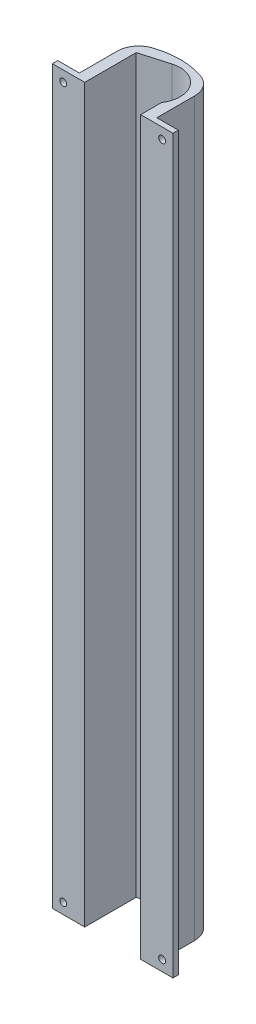
ISO-10303-21;
HEADER;
FILE_DESCRIPTION(('STEP AP214'),'2;1');
FILE_NAME('part.step','',(''),(''),'','','');
FILE_SCHEMA(('AUTOMOTIVE_DESIGN { 1 0 10303 214 1 1 1 1 }'));
ENDSEC;
DATA;
#1=APPLICATION_CONTEXT('core data for automotive mechanical design processes');
#2=APPLICATION_PROTOCOL_DEFINITION('international standard','automotive_design',2000,#1);
#3=PRODUCT_CONTEXT('',#1,'mechanical');
#4=PRODUCT('Part','Part','',(#3));
#5=PRODUCT_RELATED_PRODUCT_CATEGORY('part','',(#4));
#6=PRODUCT_DEFINITION_FORMATION('','',#4);
#7=PRODUCT_DEFINITION_CONTEXT('part definition',#1,'design');
#8=PRODUCT_DEFINITION('design','',#6,#7);
#9=PRODUCT_DEFINITION_SHAPE('','',#8);
#10=(LENGTH_UNIT() NAMED_UNIT(*) SI_UNIT(.MILLI.,.METRE.));
#11=(NAMED_UNIT(*) PLANE_ANGLE_UNIT() SI_UNIT($,.RADIAN.));
#12=(NAMED_UNIT(*) SI_UNIT($,.STERADIAN.) SOLID_ANGLE_UNIT());
#13=UNCERTAINTY_MEASURE_WITH_UNIT(LENGTH_MEASURE(1.E-05),#10,'distance_accuracy_value','');
#14=(GEOMETRIC_REPRESENTATION_CONTEXT(3) GLOBAL_UNCERTAINTY_ASSIGNED_CONTEXT((#13)) GLOBAL_UNIT_ASSIGNED_CONTEXT((#10,
#11,#12)) REPRESENTATION_CONTEXT('',''));
#15=CARTESIAN_POINT('',(0.,0.,0.));
#16=DIRECTION('',(0.,0.,1.));
#17=DIRECTION('',(1.,0.,0.));
#18=AXIS2_PLACEMENT_3D('',#15,#16,#17);
#19=CARTESIAN_POINT('',(-3.8327392524364,269.875,75.5327034117787));
#20=DIRECTION('',(0.,-1.,0.));
#21=DIRECTION('',(0.,0.,-1.));
#22=AXIS2_PLACEMENT_3D('',#19,#20,#21);
#23=CYLINDRICAL_SURFACE('',#22,3.74657028450393);
#24=CARTESIAN_POINT('',(-3.8327392524364,161.925,75.5327034117787));
#25=DIRECTION('',(0.,-1.,0.));
#26=DIRECTION('',(0.,0.,-1.));
#27=AXIS2_PLACEMENT_3D('',#24,#25,#26);
#28=CIRCLE('',#27,3.74657028450393);
#29=CARTESIAN_POINT('',(-4.87324414830084,161.925,71.9335176068486));
#30=VERTEX_POINT('',#29);
#31=CARTESIAN_POINT('',(-0.721239252436399,161.925,77.6196525359137));
#32=VERTEX_POINT('',#31);
#33=EDGE_CURVE('E169',#30,#32,#28,.T.);
#34=ORIENTED_EDGE('',*,*,#33,.T.);
#35=DIRECTION('',(0.,-1.,0.));
#36=VECTOR('',#35,1.);
#37=CARTESIAN_POINT('',(-0.721239252436399,269.875,77.6196525359137));
#38=LINE('',#37,#36);
#39=CARTESIAN_POINT('',(-0.721239252436399,269.875,77.6196525359137));
#40=VERTEX_POINT('',#39);
#41=EDGE_CURVE('E151',#40,#32,#38,.T.);
#42=ORIENTED_EDGE('',*,*,#41,.F.);
#43=CARTESIAN_POINT('',(-3.8327392524364,269.875,75.5327034117787));
#44=DIRECTION('',(0.,-1.,0.));
#45=DIRECTION('',(0.,0.,-1.));
#46=AXIS2_PLACEMENT_3D('',#43,#44,#45);
#47=CIRCLE('',#46,3.74657028450393);
#48=CARTESIAN_POINT('',(-4.87324414830084,269.875,71.9335176068486));
#49=VERTEX_POINT('',#48);
#50=EDGE_CURVE('E157',#49,#40,#47,.T.);
#51=ORIENTED_EDGE('',*,*,#50,.F.);
#52=DIRECTION('',(0.,-1.,0.));
#53=VECTOR('',#52,1.);
#54=CARTESIAN_POINT('',(-4.87324414830084,269.875,71.9335176068486));
#55=LINE('',#54,#53);
#56=EDGE_CURVE('E228',#49,#30,#55,.T.);
#57=ORIENTED_EDGE('',*,*,#56,.T.);
#58=EDGE_LOOP('',(#34,#42,#51,#57));
#59=FACE_BOUND('',#58,.T.);
#60=ADVANCED_FACE('F37',(#59),#23,.F.);
#61=CARTESIAN_POINT('',(-0.7212392524364,269.875,80.7193816335613));
#62=DIRECTION('',(1.,0.,0.));
#63=DIRECTION('',(0.,0.,-1.));
#64=AXIS2_PLACEMENT_3D('',#61,#62,#63);
#65=PLANE('',#64);
#66=DIRECTION('',(0.,0.,1.));
#67=VECTOR('',#66,1.);
#68=CARTESIAN_POINT('',(-0.7212392524364,161.925,80.7193816335613));
#69=LINE('',#68,#67);
#70=CARTESIAN_POINT('',(-0.7212392524364,161.925,80.7193816335613));
#71=VERTEX_POINT('',#70);
#72=EDGE_CURVE('E259',#32,#71,#69,.T.);
#73=ORIENTED_EDGE('',*,*,#72,.T.);
#74=DIRECTION('',(0.,-1.,0.));
#75=VECTOR('',#74,1.);
#76=CARTESIAN_POINT('',(-0.7212392524364,269.875,80.7193816335613));
#77=LINE('',#76,#75);
#78=CARTESIAN_POINT('',(-0.7212392524364,269.875,80.7193816335613));
#79=VERTEX_POINT('',#78);
#80=EDGE_CURVE('E154',#79,#71,#77,.T.);
#81=ORIENTED_EDGE('',*,*,#80,.F.);
#82=DIRECTION('',(0.,0.,1.));
#83=VECTOR('',#82,1.);
#84=CARTESIAN_POINT('',(-0.7212392524364,269.875,80.7193816335613));
#85=LINE('',#84,#83);
#86=EDGE_CURVE('E147',#40,#79,#85,.T.);
#87=ORIENTED_EDGE('',*,*,#86,.F.);
#88=ORIENTED_EDGE('',*,*,#41,.T.);
#89=EDGE_LOOP('',(#73,#81,#87,#88));
#90=FACE_BOUND('',#89,.T.);
#91=ADVANCED_FACE('F149',(#90),#65,.F.);
#92=CARTESIAN_POINT('',(-0.7212392524364,269.875,80.7193816335613));
#93=DIRECTION('',(0.,0.,-1.));
#94=DIRECTION('',(-1.,0.,0.));
#95=AXIS2_PLACEMENT_3D('',#92,#93,#94);
#96=PLANE('',#95);
#97=CARTESIAN_POINT('',(2.4537607475636,163.5125,80.7193816335613));
#98=DIRECTION('',(0.,0.,-1.));
#99=DIRECTION('',(-1.,0.,0.));
#100=AXIS2_PLACEMENT_3D('',#97,#98,#99);
#101=CIRCLE('',#100,0.508000000000002);
#102=CARTESIAN_POINT('',(1.9457607475636,163.5125,80.7193816335613));
#103=VERTEX_POINT('',#102);
#104=EDGE_CURVE('E283',#103,#103,#101,.T.);
#105=ORIENTED_EDGE('',*,*,#104,.T.);
#106=EDGE_LOOP('',(#105));
#107=FACE_BOUND('',#106,.T.);
#108=CARTESIAN_POINT('',(2.4537607475636,268.2875,80.7193816335613));
#109=DIRECTION('',(0.,0.,-1.));
#110=DIRECTION('',(-1.,0.,0.));
#111=AXIS2_PLACEMENT_3D('',#108,#109,#110);
#112=CIRCLE('',#111,0.508000000000006);
#113=CARTESIAN_POINT('',(1.94576074756359,268.2875,80.7193816335613));
#114=VERTEX_POINT('',#113);
#115=EDGE_CURVE('E264',#114,#114,#112,.T.);
#116=ORIENTED_EDGE('',*,*,#115,.T.);
#117=EDGE_LOOP('',(#116));
#118=FACE_BOUND('',#117,.T.);
#119=DIRECTION('',(1.,0.,0.));
#120=VECTOR('',#119,1.);
#121=CARTESIAN_POINT('',(-0.7212392524364,161.925,80.7193816335613));
#122=LINE('',#121,#120);
#123=CARTESIAN_POINT('',(4.0412607475636,161.925,80.7193816335613));
#124=VERTEX_POINT('',#123);
#125=EDGE_CURVE('E258',#71,#124,#122,.T.);
#126=ORIENTED_EDGE('',*,*,#125,.T.);
#127=DIRECTION('',(0.,-1.,0.));
#128=VECTOR('',#127,1.);
#129=CARTESIAN_POINT('',(4.0412607475636,269.875,80.7193816335613));
#130=LINE('',#129,#128);
#131=CARTESIAN_POINT('',(4.0412607475636,269.875,80.7193816335613));
#132=VERTEX_POINT('',#131);
#133=EDGE_CURVE('E174',#132,#124,#130,.T.);
#134=ORIENTED_EDGE('',*,*,#133,.F.);
#135=DIRECTION('',(1.,0.,0.));
#136=VECTOR('',#135,1.);
#137=CARTESIAN_POINT('',(-0.7212392524364,269.875,80.7193816335613));
#138=LINE('',#137,#136);
#139=EDGE_CURVE('E156',#79,#132,#138,.T.);
#140=ORIENTED_EDGE('',*,*,#139,.F.);
#141=ORIENTED_EDGE('',*,*,#80,.T.);
#142=EDGE_LOOP('',(#126,#134,#140,#141));
#143=FACE_BOUND('',#142,.T.);
#144=ADVANCED_FACE('F350',(#107,#118,#143),#96,.F.);
#145=CARTESIAN_POINT('',(4.0412607475636,269.875,80.7193816335613));
#146=DIRECTION('',(-1.,0.,0.));
#147=DIRECTION('',(0.,0.,1.));
#148=AXIS2_PLACEMENT_3D('',#145,#146,#147);
#149=PLANE('',#148);
#150=DIRECTION('',(0.,0.,-1.));
#151=VECTOR('',#150,1.);
#152=CARTESIAN_POINT('',(4.0412607475636,161.925,80.7193816335613));
#153=LINE('',#152,#151);
#154=CARTESIAN_POINT('',(4.0412607475636,161.925,79.9256316335613));
#155=VERTEX_POINT('',#154);
#156=EDGE_CURVE('E213',#124,#155,#153,.T.);
#157=ORIENTED_EDGE('',*,*,#156,.T.);
#158=DIRECTION('',(0.,-1.,0.));
#159=VECTOR('',#158,1.);
#160=CARTESIAN_POINT('',(4.0412607475636,269.875,79.9256316335613));
#161=LINE('',#160,#159);
#162=CARTESIAN_POINT('',(4.0412607475636,269.875,79.9256316335613));
#163=VERTEX_POINT('',#162);
#164=EDGE_CURVE('E246',#163,#155,#161,.T.);
#165=ORIENTED_EDGE('',*,*,#164,.F.);
#166=DIRECTION('',(0.,0.,-1.));
#167=VECTOR('',#166,1.);
#168=CARTESIAN_POINT('',(4.0412607475636,269.875,80.7193816335613));
#169=LINE('',#168,#167);
#170=EDGE_CURVE('E255',#132,#163,#169,.T.);
#171=ORIENTED_EDGE('',*,*,#170,.F.);
#172=ORIENTED_EDGE('',*,*,#133,.T.);
#173=EDGE_LOOP('',(#157,#165,#171,#172));
#174=FACE_BOUND('',#173,.T.);
#175=ADVANCED_FACE('F253',(#174),#149,.F.);
#176=CARTESIAN_POINT('',(4.0412607475636,269.875,79.9256316335613));
#177=DIRECTION('',(0.,0.,1.));
#178=DIRECTION('',(1.,0.,0.));
#179=AXIS2_PLACEMENT_3D('',#176,#177,#178);
#180=PLANE('',#179);
#181=CARTESIAN_POINT('',(2.4537607475636,163.5125,79.9256316335613));
#182=DIRECTION('',(0.,0.,-1.));
#183=DIRECTION('',(-1.,0.,0.));
#184=AXIS2_PLACEMENT_3D('',#181,#182,#183);
#185=CIRCLE('',#184,0.508000000000002);
#186=CARTESIAN_POINT('',(1.9457607475636,163.5125,79.9256316335613));
#187=VERTEX_POINT('',#186);
#188=EDGE_CURVE('E293',#187,#187,#185,.T.);
#189=ORIENTED_EDGE('',*,*,#188,.F.);
#190=EDGE_LOOP('',(#189));
#191=FACE_BOUND('',#190,.T.);
#192=CARTESIAN_POINT('',(2.4537607475636,268.2875,79.9256316335613));
#193=DIRECTION('',(0.,0.,-1.));
#194=DIRECTION('',(-1.,0.,0.));
#195=AXIS2_PLACEMENT_3D('',#192,#193,#194);
#196=CIRCLE('',#195,0.508000000000006);
#197=CARTESIAN_POINT('',(1.94576074756359,268.2875,79.9256316335613));
#198=VERTEX_POINT('',#197);
#199=EDGE_CURVE('E280',#198,#198,#196,.T.);
#200=ORIENTED_EDGE('',*,*,#199,.F.);
#201=EDGE_LOOP('',(#200));
#202=FACE_BOUND('',#201,.T.);
#203=DIRECTION('',(-1.,0.,0.));
#204=VECTOR('',#203,1.);
#205=CARTESIAN_POINT('',(4.0412607475636,161.925,79.9256316335613));
#206=LINE('',#205,#204);
#207=CARTESIAN_POINT('',(0.8662607475636,161.925,79.9256316335613));
#208=VERTEX_POINT('',#207);
#209=EDGE_CURVE('E209',#155,#208,#206,.T.);
#210=ORIENTED_EDGE('',*,*,#209,.T.);
#211=DIRECTION('',(0.,-1.,0.));
#212=VECTOR('',#211,1.);
#213=CARTESIAN_POINT('',(0.8662607475636,269.875,79.9256316335613));
#214=LINE('',#213,#212);
#215=CARTESIAN_POINT('',(0.8662607475636,269.875,79.9256316335613));
#216=VERTEX_POINT('',#215);
#217=EDGE_CURVE('E208',#216,#208,#214,.T.);
#218=ORIENTED_EDGE('',*,*,#217,.F.);
#219=DIRECTION('',(-1.,0.,0.));
#220=VECTOR('',#219,1.);
#221=CARTESIAN_POINT('',(4.0412607475636,269.875,79.9256316335613));
#222=LINE('',#221,#220);
#223=EDGE_CURVE('E276',#163,#216,#222,.T.);
#224=ORIENTED_EDGE('',*,*,#223,.F.);
#225=ORIENTED_EDGE('',*,*,#164,.T.);
#226=EDGE_LOOP('',(#210,#218,#224,#225));
#227=FACE_BOUND('',#226,.T.);
#228=ADVANCED_FACE('F358',(#191,#202,#227),#180,.F.);
#229=CARTESIAN_POINT('',(0.8662607475636,269.875,79.9256316335613));
#230=DIRECTION('',(-1.,0.,0.));
#231=DIRECTION('',(0.,0.,1.));
#232=AXIS2_PLACEMENT_3D('',#229,#230,#231);
#233=PLANE('',#232);
#234=DIRECTION('',(0.,0.,-1.));
#235=VECTOR('',#234,1.);
#236=CARTESIAN_POINT('',(0.8662607475636,161.925,79.9256316335613));
#237=LINE('',#236,#235);
#238=CARTESIAN_POINT('',(0.866260747563601,161.925,74.3360844639837));
#239=VERTEX_POINT('',#238);
#240=EDGE_CURVE('E203',#208,#239,#237,.T.);
#241=ORIENTED_EDGE('',*,*,#240,.T.);
#242=DIRECTION('',(0.,-1.,0.));
#243=VECTOR('',#242,1.);
#244=CARTESIAN_POINT('',(0.866260747563601,269.875,74.3360844639837));
#245=LINE('',#244,#243);
#246=CARTESIAN_POINT('',(0.866260747563601,269.875,74.3360844639837));
#247=VERTEX_POINT('',#246);
#248=EDGE_CURVE('E60',#239,#247,#245,.F.);
#249=ORIENTED_EDGE('',*,*,#248,.T.);
#250=DIRECTION('',(0.,0.,-1.));
#251=VECTOR('',#250,1.);
#252=CARTESIAN_POINT('',(0.8662607475636,269.875,79.9256316335613));
#253=LINE('',#252,#251);
#254=EDGE_CURVE('E188',#216,#247,#253,.T.);
#255=ORIENTED_EDGE('',*,*,#254,.F.);
#256=ORIENTED_EDGE('',*,*,#217,.T.);
#257=EDGE_LOOP('',(#241,#249,#255,#256));
#258=FACE_BOUND('',#257,.T.);
#259=ADVANCED_FACE('F206',(#258),#233,.F.);
#260=CARTESIAN_POINT('',(-4.8487392524364,269.875,81.8562112082613));
#261=DIRECTION('',(0.,-1.,0.));
#262=DIRECTION('',(0.,0.,-1.));
#263=AXIS2_PLACEMENT_3D('',#260,#261,#262);
#264=CYLINDRICAL_SURFACE('',#263,11.1125);
#265=CARTESIAN_POINT('',(-4.8487392524364,269.875,81.8562112082613));
#266=DIRECTION('',(0.,1.,0.));
#267=DIRECTION('',(0.,0.,-1.));
#268=AXIS2_PLACEMENT_3D('',#265,#266,#267);
#269=CIRCLE('',#268,11.1125);
#270=CARTESIAN_POINT('',(-1.2927392524364,269.875,71.3280337662726));
#271=VERTEX_POINT('',#270);
#272=CARTESIAN_POINT('',(-8.4047392524364,269.875,71.3280337662726));
#273=VERTEX_POINT('',#272);
#274=EDGE_CURVE('E187',#271,#273,#269,.T.);
#275=ORIENTED_EDGE('',*,*,#274,.F.);
#276=DIRECTION('',(0.,-1.,0.));
#277=VECTOR('',#276,1.);
#278=CARTESIAN_POINT('',(-1.2927392524364,269.875,71.3280337662726));
#279=LINE('',#278,#277);
#280=CARTESIAN_POINT('',(-1.2927392524364,161.925,71.3280337662726));
#281=VERTEX_POINT('',#280);
#282=EDGE_CURVE('E172',#271,#281,#279,.T.);
#283=ORIENTED_EDGE('',*,*,#282,.T.);
#284=CARTESIAN_POINT('',(-4.8487392524364,161.925,81.8562112082613));
#285=DIRECTION('',(0.,1.,0.));
#286=DIRECTION('',(0.,0.,-1.));
#287=AXIS2_PLACEMENT_3D('',#284,#285,#286);
#288=CIRCLE('',#287,11.1125);
#289=CARTESIAN_POINT('',(-8.4047392524364,161.925,71.3280337662726));
#290=VERTEX_POINT('',#289);
#291=EDGE_CURVE('E204',#281,#290,#288,.T.);
#292=ORIENTED_EDGE('',*,*,#291,.T.);
#293=DIRECTION('',(0.,-1.,0.));
#294=VECTOR('',#293,1.);
#295=CARTESIAN_POINT('',(-8.4047392524364,269.875,71.3280337662726));
#296=LINE('',#295,#294);
#297=EDGE_CURVE('E170',#290,#273,#296,.F.);
#298=ORIENTED_EDGE('',*,*,#297,.T.);
#299=EDGE_LOOP('',(#275,#283,#292,#298));
#300=FACE_BOUND('',#299,.T.);
#301=ADVANCED_FACE('F192',(#300),#264,.T.);
#302=CARTESIAN_POINT('',(-10.5637392524364,269.875,79.9256316335613));
#303=DIRECTION('',(1.,0.,0.));
#304=DIRECTION('',(0.,0.,-1.));
#305=AXIS2_PLACEMENT_3D('',#302,#303,#304);
#306=PLANE('',#305);
#307=DIRECTION('',(0.,0.,1.));
#308=VECTOR('',#307,1.);
#309=CARTESIAN_POINT('',(-10.5637392524364,269.875,79.9256316335613));
#310=LINE('',#309,#308);
#311=CARTESIAN_POINT('',(-10.5637392524364,269.875,74.3360844639837));
#312=VERTEX_POINT('',#311);
#313=CARTESIAN_POINT('',(-10.5637392524364,269.875,79.9256316335613));
#314=VERTEX_POINT('',#313);
#315=EDGE_CURVE('E196',#312,#314,#310,.T.);
#316=ORIENTED_EDGE('',*,*,#315,.F.);
#317=DIRECTION('',(0.,-1.,0.));
#318=VECTOR('',#317,1.);
#319=CARTESIAN_POINT('',(-10.5637392524364,269.875,74.3360844639837));
#320=LINE('',#319,#318);
#321=CARTESIAN_POINT('',(-10.5637392524364,161.925,74.3360844639837));
#322=VERTEX_POINT('',#321);
#323=EDGE_CURVE('E11',#312,#322,#320,.T.);
#324=ORIENTED_EDGE('',*,*,#323,.T.);
#325=DIRECTION('',(0.,0.,1.));
#326=VECTOR('',#325,1.);
#327=CARTESIAN_POINT('',(-10.5637392524364,161.925,79.9256316335613));
#328=LINE('',#327,#326);
#329=CARTESIAN_POINT('',(-10.5637392524364,161.925,79.9256316335613));
#330=VERTEX_POINT('',#329);
#331=EDGE_CURVE('E211',#322,#330,#328,.T.);
#332=ORIENTED_EDGE('',*,*,#331,.T.);
#333=DIRECTION('',(0.,-1.,0.));
#334=VECTOR('',#333,1.);
#335=CARTESIAN_POINT('',(-10.5637392524364,269.875,79.9256316335613));
#336=LINE('',#335,#334);
#337=EDGE_CURVE('E242',#314,#330,#336,.T.);
#338=ORIENTED_EDGE('',*,*,#337,.F.);
#339=EDGE_LOOP('',(#316,#324,#332,#338));
#340=FACE_BOUND('',#339,.T.);
#341=ADVANCED_FACE('F318',(#340),#306,.F.);
#342=CARTESIAN_POINT('',(-13.7387392524364,269.875,79.9256316335613));
#343=DIRECTION('',(0.,0.,1.));
#344=DIRECTION('',(1.,0.,0.));
#345=AXIS2_PLACEMENT_3D('',#342,#343,#344);
#346=PLANE('',#345);
#347=CARTESIAN_POINT('',(-12.1512392524364,268.2875,79.9256316335613));
#348=DIRECTION('',(0.,0.,-1.));
#349=DIRECTION('',(-1.,0.,0.));
#350=AXIS2_PLACEMENT_3D('',#347,#348,#349);
#351=CIRCLE('',#350,0.508000000000005);
#352=CARTESIAN_POINT('',(-12.6592392524364,268.2875,79.9256316335613));
#353=VERTEX_POINT('',#352);
#354=EDGE_CURVE('E286',#353,#353,#351,.T.);
#355=ORIENTED_EDGE('',*,*,#354,.F.);
#356=EDGE_LOOP('',(#355));
#357=FACE_BOUND('',#356,.T.);
#358=CARTESIAN_POINT('',(-12.1512392524364,163.5125,79.9256316335613));
#359=DIRECTION('',(0.,0.,-1.));
#360=DIRECTION('',(-1.,0.,0.));
#361=AXIS2_PLACEMENT_3D('',#358,#359,#360);
#362=CIRCLE('',#361,0.508000000000002);
#363=CARTESIAN_POINT('',(-12.6592392524364,163.5125,79.9256316335613));
#364=VERTEX_POINT('',#363);
#365=EDGE_CURVE('E298',#364,#364,#362,.T.);
#366=ORIENTED_EDGE('',*,*,#365,.F.);
#367=EDGE_LOOP('',(#366));
#368=FACE_BOUND('',#367,.T.);
#369=DIRECTION('',(-1.,0.,0.));
#370=VECTOR('',#369,1.);
#371=CARTESIAN_POINT('',(-13.7387392524364,161.925,79.9256316335613));
#372=LINE('',#371,#370);
#373=CARTESIAN_POINT('',(-13.7387392524364,161.925,79.9256316335613));
#374=VERTEX_POINT('',#373);
#375=EDGE_CURVE('E218',#330,#374,#372,.T.);
#376=ORIENTED_EDGE('',*,*,#375,.T.);
#377=DIRECTION('',(0.,-1.,0.));
#378=VECTOR('',#377,1.);
#379=CARTESIAN_POINT('',(-13.7387392524364,269.875,79.9256316335613));
#380=LINE('',#379,#378);
#381=CARTESIAN_POINT('',(-13.7387392524364,269.875,79.9256316335613));
#382=VERTEX_POINT('',#381);
#383=EDGE_CURVE('E239',#382,#374,#380,.T.);
#384=ORIENTED_EDGE('',*,*,#383,.F.);
#385=DIRECTION('',(-1.,0.,0.));
#386=VECTOR('',#385,1.);
#387=CARTESIAN_POINT('',(-13.7387392524364,269.875,79.9256316335613));
#388=LINE('',#387,#386);
#389=EDGE_CURVE('E272',#314,#382,#388,.T.);
#390=ORIENTED_EDGE('',*,*,#389,.F.);
#391=ORIENTED_EDGE('',*,*,#337,.T.);
#392=EDGE_LOOP('',(#376,#384,#390,#391));
#393=FACE_BOUND('',#392,.T.);
#394=ADVANCED_FACE('F314',(#357,#368,#393),#346,.F.);
#395=CARTESIAN_POINT('',(-13.7387392524364,269.875,80.7193816335613));
#396=DIRECTION('',(1.,0.,0.));
#397=DIRECTION('',(0.,0.,-1.));
#398=AXIS2_PLACEMENT_3D('',#395,#396,#397);
#399=PLANE('',#398);
#400=DIRECTION('',(0.,0.,1.));
#401=VECTOR('',#400,1.);
#402=CARTESIAN_POINT('',(-13.7387392524364,161.925,80.7193816335613));
#403=LINE('',#402,#401);
#404=CARTESIAN_POINT('',(-13.7387392524364,161.925,80.7193816335613));
#405=VERTEX_POINT('',#404);
#406=EDGE_CURVE('E220',#374,#405,#403,.T.);
#407=ORIENTED_EDGE('',*,*,#406,.T.);
#408=DIRECTION('',(0.,-1.,0.));
#409=VECTOR('',#408,1.);
#410=CARTESIAN_POINT('',(-13.7387392524364,269.875,80.7193816335613));
#411=LINE('',#410,#409);
#412=CARTESIAN_POINT('',(-13.7387392524364,269.875,80.7193816335613));
#413=VERTEX_POINT('',#412);
#414=EDGE_CURVE('E236',#413,#405,#411,.T.);
#415=ORIENTED_EDGE('',*,*,#414,.F.);
#416=DIRECTION('',(0.,0.,1.));
#417=VECTOR('',#416,1.);
#418=CARTESIAN_POINT('',(-13.7387392524364,269.875,80.7193816335613));
#419=LINE('',#418,#417);
#420=EDGE_CURVE('E270',#382,#413,#419,.T.);
#421=ORIENTED_EDGE('',*,*,#420,.F.);
#422=ORIENTED_EDGE('',*,*,#383,.T.);
#423=EDGE_LOOP('',(#407,#415,#421,#422));
#424=FACE_BOUND('',#423,.T.);
#425=ADVANCED_FACE('F317',(#424),#399,.F.);
#426=CARTESIAN_POINT('',(-13.7387392524364,269.875,80.7193816335613));
#427=DIRECTION('',(0.,0.,-1.));
#428=DIRECTION('',(-1.,0.,0.));
#429=AXIS2_PLACEMENT_3D('',#426,#427,#428);
#430=PLANE('',#429);
#431=CARTESIAN_POINT('',(-12.1512392524364,268.2875,80.7193816335613));
#432=DIRECTION('',(0.,0.,-1.));
#433=DIRECTION('',(-1.,0.,0.));
#434=AXIS2_PLACEMENT_3D('',#431,#432,#433);
#435=CIRCLE('',#434,0.508000000000005);
#436=CARTESIAN_POINT('',(-12.6592392524364,268.2875,80.7193816335613));
#437=VERTEX_POINT('',#436);
#438=EDGE_CURVE('E289',#437,#437,#435,.T.);
#439=ORIENTED_EDGE('',*,*,#438,.T.);
#440=EDGE_LOOP('',(#439));
#441=FACE_BOUND('',#440,.T.);
#442=CARTESIAN_POINT('',(-12.1512392524364,163.5125,80.7193816335613));
#443=DIRECTION('',(0.,0.,-1.));
#444=DIRECTION('',(-1.,0.,0.));
#445=AXIS2_PLACEMENT_3D('',#442,#443,#444);
#446=CIRCLE('',#445,0.508000000000002);
#447=CARTESIAN_POINT('',(-12.6592392524364,163.5125,80.7193816335613));
#448=VERTEX_POINT('',#447);
#449=EDGE_CURVE('E290',#448,#448,#446,.T.);
#450=ORIENTED_EDGE('',*,*,#449,.T.);
#451=EDGE_LOOP('',(#450));
#452=FACE_BOUND('',#451,.T.);
#453=DIRECTION('',(1.,0.,0.));
#454=VECTOR('',#453,1.);
#455=CARTESIAN_POINT('',(-13.7387392524364,161.925,80.7193816335613));
#456=LINE('',#455,#454);
#457=CARTESIAN_POINT('',(-8.9762392524364,161.925,80.7193816335613));
#458=VERTEX_POINT('',#457);
#459=EDGE_CURVE('E222',#405,#458,#456,.T.);
#460=ORIENTED_EDGE('',*,*,#459,.T.);
#461=DIRECTION('',(0.,-1.,0.));
#462=VECTOR('',#461,1.);
#463=CARTESIAN_POINT('',(-8.9762392524364,269.875,80.7193816335613));
#464=LINE('',#463,#462);
#465=CARTESIAN_POINT('',(-8.9762392524364,269.875,80.7193816335613));
#466=VERTEX_POINT('',#465);
#467=EDGE_CURVE('E233',#466,#458,#464,.T.);
#468=ORIENTED_EDGE('',*,*,#467,.F.);
#469=DIRECTION('',(1.,0.,0.));
#470=VECTOR('',#469,1.);
#471=CARTESIAN_POINT('',(-13.7387392524364,269.875,80.7193816335613));
#472=LINE('',#471,#470);
#473=EDGE_CURVE('E268',#413,#466,#472,.T.);
#474=ORIENTED_EDGE('',*,*,#473,.F.);
#475=ORIENTED_EDGE('',*,*,#414,.T.);
#476=EDGE_LOOP('',(#460,#468,#474,#475));
#477=FACE_BOUND('',#476,.T.);
#478=ADVANCED_FACE('F304',(#441,#452,#477),#430,.F.);
#479=CARTESIAN_POINT('',(-8.9762392524364,269.875,77.9457034117787));
#480=DIRECTION('',(-1.,0.,0.));
#481=DIRECTION('',(0.,0.,1.));
#482=AXIS2_PLACEMENT_3D('',#479,#480,#481);
#483=PLANE('',#482);
#484=DIRECTION('',(0.,0.,-1.));
#485=VECTOR('',#484,1.);
#486=CARTESIAN_POINT('',(-8.9762392524364,161.925,77.9457034117787));
#487=LINE('',#486,#485);
#488=CARTESIAN_POINT('',(-8.9762392524364,161.925,73.119671010686));
#489=VERTEX_POINT('',#488);
#490=EDGE_CURVE('E225',#458,#489,#487,.T.);
#491=ORIENTED_EDGE('',*,*,#490,.T.);
#492=DIRECTION('',(0.,-1.,0.));
#493=VECTOR('',#492,1.);
#494=CARTESIAN_POINT('',(-8.9762392524364,269.875,73.119671010686));
#495=LINE('',#494,#493);
#496=CARTESIAN_POINT('',(-8.9762392524364,269.875,73.119671010686));
#497=VERTEX_POINT('',#496);
#498=EDGE_CURVE('E230',#497,#489,#495,.T.);
#499=ORIENTED_EDGE('',*,*,#498,.F.);
#500=DIRECTION('',(0.,0.,-1.));
#501=VECTOR('',#500,1.);
#502=CARTESIAN_POINT('',(-8.9762392524364,269.875,77.9457034117787));
#503=LINE('',#502,#501);
#504=EDGE_CURVE('E266',#466,#497,#503,.T.);
#505=ORIENTED_EDGE('',*,*,#504,.F.);
#506=ORIENTED_EDGE('',*,*,#467,.T.);
#507=EDGE_LOOP('',(#491,#499,#505,#506));
#508=FACE_BOUND('',#507,.T.);
#509=ADVANCED_FACE('F336',(#508),#483,.F.);
#510=CARTESIAN_POINT('',(-8.9762392524364,269.875,73.119671010686));
#511=DIRECTION('',(-0.27772197419278,0.,-0.960661493477523));
#512=DIRECTION('',(-0.960661493477523,0.,0.27772197419278));
#513=AXIS2_PLACEMENT_3D('',#510,#511,#512);
#514=PLANE('',#513);
#515=DIRECTION('',(0.960661493477523,0.,-0.27772197419278));
#516=VECTOR('',#515,1.);
#517=CARTESIAN_POINT('',(-8.9762392524364,161.925,73.119671010686));
#518=LINE('',#517,#516);
#519=EDGE_CURVE('E166',#489,#30,#518,.T.);
#520=ORIENTED_EDGE('',*,*,#519,.T.);
#521=ORIENTED_EDGE('',*,*,#56,.F.);
#522=DIRECTION('',(0.960661493477523,0.,-0.27772197419278));
#523=VECTOR('',#522,1.);
#524=CARTESIAN_POINT('',(-8.9762392524364,269.875,73.119671010686));
#525=LINE('',#524,#523);
#526=EDGE_CURVE('E162',#497,#49,#525,.T.);
#527=ORIENTED_EDGE('',*,*,#526,.F.);
#528=ORIENTED_EDGE('',*,*,#498,.T.);
#529=EDGE_LOOP('',(#520,#521,#527,#528));
#530=FACE_BOUND('',#529,.T.);
#531=ADVANCED_FACE('F375',(#530),#514,.F.);
#532=CARTESIAN_POINT('',(-3.8327392524364,269.875,75.5327034117787));
#533=DIRECTION('',(0.,-1.,0.));
#534=DIRECTION('',(0.,0.,-1.));
#535=AXIS2_PLACEMENT_3D('',#532,#533,#534);
#536=PLANE('',#535);
#537=ORIENTED_EDGE('',*,*,#254,.T.);
#538=CARTESIAN_POINT('',(-2.3087392524364,269.875,74.3360844639837));
#539=DIRECTION('',(0.,-1.,0.));
#540=DIRECTION('',(0.,0.,-1.));
#541=AXIS2_PLACEMENT_3D('',#538,#539,#540);
#542=CIRCLE('',#541,3.175);
#543=EDGE_CURVE('E45',#247,#271,#542,.F.);
#544=ORIENTED_EDGE('',*,*,#543,.T.);
#545=ORIENTED_EDGE('',*,*,#274,.T.);
#546=CARTESIAN_POINT('',(-7.3887392524364,269.875,74.3360844639837));
#547=DIRECTION('',(0.,-1.,0.));
#548=DIRECTION('',(0.,0.,-1.));
#549=AXIS2_PLACEMENT_3D('',#546,#547,#548);
#550=CIRCLE('',#549,3.175);
#551=EDGE_CURVE('E52',#273,#312,#550,.F.);
#552=ORIENTED_EDGE('',*,*,#551,.T.);
#553=ORIENTED_EDGE('',*,*,#315,.T.);
#554=ORIENTED_EDGE('',*,*,#389,.T.);
#555=ORIENTED_EDGE('',*,*,#420,.T.);
#556=ORIENTED_EDGE('',*,*,#473,.T.);
#557=ORIENTED_EDGE('',*,*,#504,.T.);
#558=ORIENTED_EDGE('',*,*,#526,.T.);
#559=ORIENTED_EDGE('',*,*,#50,.T.);
#560=ORIENTED_EDGE('',*,*,#86,.T.);
#561=ORIENTED_EDGE('',*,*,#139,.T.);
#562=ORIENTED_EDGE('',*,*,#170,.T.);
#563=ORIENTED_EDGE('',*,*,#223,.T.);
#564=EDGE_LOOP('',(#537,#544,#545,#552,#553,#554,#555,#556,#557,#558,#559,#560,#561,#562,#563));
#565=FACE_BOUND('',#564,.T.);
#566=ADVANCED_FACE('F160',(#565),#536,.F.);
#567=CARTESIAN_POINT('',(-3.8327392524364,161.925,75.5327034117787));
#568=DIRECTION('',(0.,-1.,0.));
#569=DIRECTION('',(0.,0.,-1.));
#570=AXIS2_PLACEMENT_3D('',#567,#568,#569);
#571=PLANE('',#570);
#572=ORIENTED_EDGE('',*,*,#291,.F.);
#573=CARTESIAN_POINT('',(-2.3087392524364,161.925,74.3360844639837));
#574=DIRECTION('',(0.,-1.,0.));
#575=DIRECTION('',(0.,0.,-1.));
#576=AXIS2_PLACEMENT_3D('',#573,#574,#575);
#577=CIRCLE('',#576,3.175);
#578=EDGE_CURVE('E182',#281,#239,#577,.T.);
#579=ORIENTED_EDGE('',*,*,#578,.T.);
#580=ORIENTED_EDGE('',*,*,#240,.F.);
#581=ORIENTED_EDGE('',*,*,#209,.F.);
#582=ORIENTED_EDGE('',*,*,#156,.F.);
#583=ORIENTED_EDGE('',*,*,#125,.F.);
#584=ORIENTED_EDGE('',*,*,#72,.F.);
#585=ORIENTED_EDGE('',*,*,#33,.F.);
#586=ORIENTED_EDGE('',*,*,#519,.F.);
#587=ORIENTED_EDGE('',*,*,#490,.F.);
#588=ORIENTED_EDGE('',*,*,#459,.F.);
#589=ORIENTED_EDGE('',*,*,#406,.F.);
#590=ORIENTED_EDGE('',*,*,#375,.F.);
#591=ORIENTED_EDGE('',*,*,#331,.F.);
#592=CARTESIAN_POINT('',(-7.3887392524364,161.925,74.3360844639837));
#593=DIRECTION('',(0.,-1.,0.));
#594=DIRECTION('',(0.,0.,-1.));
#595=AXIS2_PLACEMENT_3D('',#592,#593,#594);
#596=CIRCLE('',#595,3.175);
#597=EDGE_CURVE('E180',#322,#290,#596,.T.);
#598=ORIENTED_EDGE('',*,*,#597,.T.);
#599=EDGE_LOOP('',(#572,#579,#580,#581,#582,#583,#584,#585,#586,#587,#588,#589,#590,#591,#598));
#600=FACE_BOUND('',#599,.T.);
#601=ADVANCED_FACE('F201',(#600),#571,.T.);
#602=CARTESIAN_POINT('',(-2.3087392524364,269.875,74.3360844639837));
#603=DIRECTION('',(0.,-1.,0.));
#604=DIRECTION('',(0.,0.,-1.));
#605=AXIS2_PLACEMENT_3D('',#602,#603,#604);
#606=CYLINDRICAL_SURFACE('',#605,3.175);
#607=ORIENTED_EDGE('',*,*,#543,.F.);
#608=ORIENTED_EDGE('',*,*,#248,.F.);
#609=ORIENTED_EDGE('',*,*,#578,.F.);
#610=ORIENTED_EDGE('',*,*,#282,.F.);
#611=EDGE_LOOP('',(#607,#608,#609,#610));
#612=FACE_BOUND('',#611,.T.);
#613=ADVANCED_FACE('F198',(#612),#606,.T.);
#614=CARTESIAN_POINT('',(-7.3887392524364,269.875,74.3360844639837));
#615=DIRECTION('',(0.,-1.,0.));
#616=DIRECTION('',(0.,0.,-1.));
#617=AXIS2_PLACEMENT_3D('',#614,#615,#616);
#618=CYLINDRICAL_SURFACE('',#617,3.175);
#619=ORIENTED_EDGE('',*,*,#551,.F.);
#620=ORIENTED_EDGE('',*,*,#297,.F.);
#621=ORIENTED_EDGE('',*,*,#597,.F.);
#622=ORIENTED_EDGE('',*,*,#323,.F.);
#623=EDGE_LOOP('',(#619,#620,#621,#622));
#624=FACE_BOUND('',#623,.T.);
#625=ADVANCED_FACE('F39',(#624),#618,.T.);
#626=CARTESIAN_POINT('',(-12.1512392524364,163.5125,80.7193816335613));
#627=DIRECTION('',(0.,0.,-1.));
#628=DIRECTION('',(-1.,0.,0.));
#629=AXIS2_PLACEMENT_3D('',#626,#627,#628);
#630=CYLINDRICAL_SURFACE('',#629,0.508000000000002);
#631=ORIENTED_EDGE('',*,*,#449,.F.);
#632=EDGE_LOOP('',(#631));
#633=FACE_BOUND('',#632,.T.);
#634=ORIENTED_EDGE('',*,*,#365,.T.);
#635=EDGE_LOOP('',(#634));
#636=FACE_BOUND('',#635,.T.);
#637=ADVANCED_FACE('F307',(#633,#636),#630,.F.);
#638=CARTESIAN_POINT('',(-12.1512392524364,268.2875,80.7193816335613));
#639=DIRECTION('',(0.,0.,-1.));
#640=DIRECTION('',(-1.,0.,0.));
#641=AXIS2_PLACEMENT_3D('',#638,#639,#640);
#642=CYLINDRICAL_SURFACE('',#641,0.508000000000005);
#643=ORIENTED_EDGE('',*,*,#438,.F.);
#644=EDGE_LOOP('',(#643));
#645=FACE_BOUND('',#644,.T.);
#646=ORIENTED_EDGE('',*,*,#354,.T.);
#647=EDGE_LOOP('',(#646));
#648=FACE_BOUND('',#647,.T.);
#649=ADVANCED_FACE('F310',(#645,#648),#642,.F.);
#650=CARTESIAN_POINT('',(2.4537607475636,268.2875,80.7193816335613));
#651=DIRECTION('',(0.,0.,-1.));
#652=DIRECTION('',(-1.,0.,0.));
#653=AXIS2_PLACEMENT_3D('',#650,#651,#652);
#654=CYLINDRICAL_SURFACE('',#653,0.508000000000006);
#655=ORIENTED_EDGE('',*,*,#115,.F.);
#656=EDGE_LOOP('',(#655));
#657=FACE_BOUND('',#656,.T.);
#658=ORIENTED_EDGE('',*,*,#199,.T.);
#659=EDGE_LOOP('',(#658));
#660=FACE_BOUND('',#659,.T.);
#661=ADVANCED_FACE('F383',(#657,#660),#654,.F.);
#662=CARTESIAN_POINT('',(2.4537607475636,163.5125,80.7193816335613));
#663=DIRECTION('',(0.,0.,-1.));
#664=DIRECTION('',(-1.,0.,0.));
#665=AXIS2_PLACEMENT_3D('',#662,#663,#664);
#666=CYLINDRICAL_SURFACE('',#665,0.508000000000002);
#667=ORIENTED_EDGE('',*,*,#104,.F.);
#668=EDGE_LOOP('',(#667));
#669=FACE_BOUND('',#668,.T.);
#670=ORIENTED_EDGE('',*,*,#188,.T.);
#671=EDGE_LOOP('',(#670));
#672=FACE_BOUND('',#671,.T.);
#673=ADVANCED_FACE('F386',(#669,#672),#666,.F.);
#674=CLOSED_SHELL('',(#60,#91,#144,#175,#228,#259,#301,#341,#394,#425,#478,#509,#531,#566,#601,
#613,#625,#637,#649,#661,#673));
#675=MANIFOLD_SOLID_BREP('B2',#674);
#676=ADVANCED_BREP_SHAPE_REPRESENTATION('',(#18,#675),#14);
#677=SHAPE_DEFINITION_REPRESENTATION(#9,#676);
ENDSEC;
END-ISO-10303-21;
